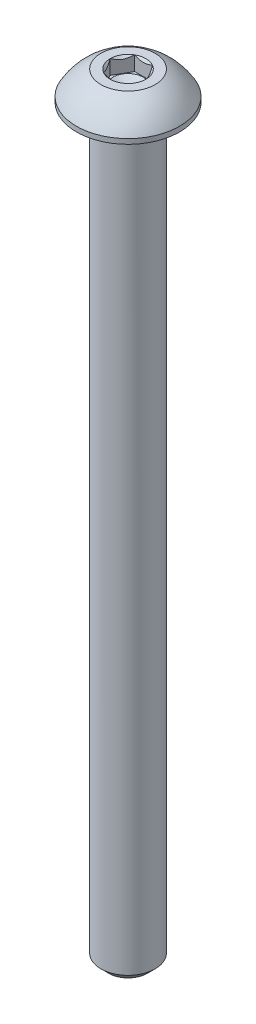
ISO-10303-21;
HEADER;
FILE_DESCRIPTION(('STEP AP214'),'2;1');
FILE_NAME('part.step','',(''),(''),'','','');
FILE_SCHEMA(('AUTOMOTIVE_DESIGN { 1 0 10303 214 1 1 1 1 }'));
ENDSEC;
DATA;
#1=APPLICATION_CONTEXT('core data for automotive mechanical design processes');
#2=APPLICATION_PROTOCOL_DEFINITION('international standard','automotive_design',2000,#1);
#3=PRODUCT_CONTEXT('',#1,'mechanical');
#4=PRODUCT('Part','Part','',(#3));
#5=PRODUCT_RELATED_PRODUCT_CATEGORY('part','',(#4));
#6=PRODUCT_DEFINITION_FORMATION('','',#4);
#7=PRODUCT_DEFINITION_CONTEXT('part definition',#1,'design');
#8=PRODUCT_DEFINITION('design','',#6,#7);
#9=PRODUCT_DEFINITION_SHAPE('','',#8);
#10=(LENGTH_UNIT() NAMED_UNIT(*) SI_UNIT(.MILLI.,.METRE.));
#11=(NAMED_UNIT(*) PLANE_ANGLE_UNIT() SI_UNIT($,.RADIAN.));
#12=(NAMED_UNIT(*) SI_UNIT($,.STERADIAN.) SOLID_ANGLE_UNIT());
#13=UNCERTAINTY_MEASURE_WITH_UNIT(LENGTH_MEASURE(1.E-05),#10,'distance_accuracy_value','');
#14=(GEOMETRIC_REPRESENTATION_CONTEXT(3) GLOBAL_UNCERTAINTY_ASSIGNED_CONTEXT((#13)) GLOBAL_UNIT_ASSIGNED_CONTEXT((#10,
#11,#12)) REPRESENTATION_CONTEXT('',''));
#15=CARTESIAN_POINT('',(0.,0.,0.));
#16=DIRECTION('',(0.,0.,1.));
#17=DIRECTION('',(1.,0.,0.));
#18=AXIS2_PLACEMENT_3D('',#15,#16,#17);
#19=CARTESIAN_POINT('',(0.,0.,0.));
#20=DIRECTION('',(0.,1.,0.));
#21=DIRECTION('',(0.,0.,1.));
#22=AXIS2_PLACEMENT_3D('',#19,#20,#21);
#23=PLANE('',#22);
#24=CARTESIAN_POINT('',(0.,0.,0.));
#25=DIRECTION('',(0.,-1.,0.));
#26=DIRECTION('',(-1.,0.,0.));
#27=AXIS2_PLACEMENT_3D('',#24,#25,#26);
#28=CIRCLE('',#27,1.4859);
#29=CARTESIAN_POINT('',(-1.4859,0.,0.));
#30=VERTEX_POINT('',#29);
#31=EDGE_CURVE('E182',#30,#30,#28,.T.);
#32=ORIENTED_EDGE('',*,*,#31,.T.);
#33=EDGE_LOOP('',(#32));
#34=FACE_BOUND('',#33,.T.);
#35=ADVANCED_FACE('F16',(#34),#23,.F.);
#36=CARTESIAN_POINT('',(0.,0.,0.));
#37=DIRECTION('',(0.,-1.,0.));
#38=DIRECTION('',(-1.,0.,0.));
#39=AXIS2_PLACEMENT_3D('',#36,#37,#38);
#40=CYLINDRICAL_SURFACE('',#39,2.0828);
#41=CARTESIAN_POINT('',(0.,57.15,0.));
#42=DIRECTION('',(0.,1.,0.));
#43=DIRECTION('',(-1.,0.,0.));
#44=AXIS2_PLACEMENT_3D('',#41,#42,#43);
#45=CIRCLE('',#44,2.0828);
#46=CARTESIAN_POINT('',(-2.0828,57.15,0.));
#47=VERTEX_POINT('',#46);
#48=EDGE_CURVE('E176',#47,#47,#45,.T.);
#49=ORIENTED_EDGE('',*,*,#48,.F.);
#50=EDGE_LOOP('',(#49));
#51=FACE_BOUND('',#50,.T.);
#52=CARTESIAN_POINT('',(0.,0.5969,0.));
#53=DIRECTION('',(0.,1.,0.));
#54=DIRECTION('',(-1.,0.,0.));
#55=AXIS2_PLACEMENT_3D('',#52,#53,#54);
#56=CIRCLE('',#55,2.0828);
#57=CARTESIAN_POINT('',(2.0828,0.5969,0.));
#58=VERTEX_POINT('',#57);
#59=EDGE_CURVE('E181',#58,#58,#56,.T.);
#60=ORIENTED_EDGE('',*,*,#59,.T.);
#61=EDGE_LOOP('',(#60));
#62=FACE_BOUND('',#61,.T.);
#63=ADVANCED_FACE('F507',(#51,#62),#40,.T.);
#64=CARTESIAN_POINT('',(0.,57.3405,0.));
#65=DIRECTION('',(0.,1.,0.));
#66=DIRECTION('',(0.,0.,-1.));
#67=AXIS2_PLACEMENT_3D('',#64,#65,#66);
#68=CYLINDRICAL_SURFACE('',#67,3.9624);
#69=CARTESIAN_POINT('',(0.,57.15,0.));
#70=DIRECTION('',(0.,-1.,0.));
#71=DIRECTION('',(1.,0.,0.));
#72=AXIS2_PLACEMENT_3D('',#69,#70,#71);
#73=CIRCLE('',#72,3.9624);
#74=CARTESIAN_POINT('',(0.,57.15,-3.9624));
#75=VERTEX_POINT('',#74);
#76=EDGE_CURVE('E96',#75,#75,#73,.T.);
#77=ORIENTED_EDGE('',*,*,#76,.F.);
#78=EDGE_LOOP('',(#77));
#79=FACE_BOUND('',#78,.T.);
#80=CARTESIAN_POINT('',(0.,57.531,0.));
#81=DIRECTION('',(0.,-1.,0.));
#82=DIRECTION('',(1.,0.,0.));
#83=AXIS2_PLACEMENT_3D('',#80,#81,#82);
#84=CIRCLE('',#83,3.9624);
#85=CARTESIAN_POINT('',(0.,57.531,-3.9624));
#86=VERTEX_POINT('',#85);
#87=EDGE_CURVE('E10',#86,#86,#84,.T.);
#88=ORIENTED_EDGE('',*,*,#87,.T.);
#89=EDGE_LOOP('',(#88));
#90=FACE_BOUND('',#89,.T.);
#91=ADVANCED_FACE('F317',(#79,#90),#68,.T.);
#92=CARTESIAN_POINT('',(0.,55.3388388888889,0.));
#93=DIRECTION('',(0.,0.,1.));
#94=DIRECTION('',(1.,0.,0.));
#95=AXIS2_PLACEMENT_3D('',#92,#93,#94);
#96=SPHERICAL_SURFACE('',#95,4.52837543685016);
#97=CARTESIAN_POINT('',(0.,55.3388388888889,0.));
#98=DIRECTION('',(0.,-1.,0.));
#99=DIRECTION('',(1.,0.,0.));
#100=AXIS2_PLACEMENT_3D('',#97,#98,#99);
#101=SPHERICAL_SURFACE('',#100,4.52837543685016);
#102=ORIENTED_EDGE('',*,*,#87,.F.);
#103=EDGE_LOOP('',(#102));
#104=FACE_BOUND('',#103,.T.);
#105=CARTESIAN_POINT('',(0.,59.3598,0.));
#106=DIRECTION('',(0.,-1.,0.));
#107=DIRECTION('',(1.,0.,0.));
#108=AXIS2_PLACEMENT_3D('',#105,#106,#107);
#109=CIRCLE('',#108,2.0828);
#110=CARTESIAN_POINT('',(0.,59.3598,-2.0828));
#111=VERTEX_POINT('',#110);
#112=EDGE_CURVE('E179',#111,#111,#109,.T.);
#113=ORIENTED_EDGE('',*,*,#112,.T.);
#114=EDGE_LOOP('',(#113));
#115=FACE_BOUND('',#114,.T.);
#116=ADVANCED_FACE('F315',(#104,#115),#101,.T.);
#117=CARTESIAN_POINT('',(0.,58.0771,0.));
#118=DIRECTION('',(0.,1.,0.));
#119=DIRECTION('',(0.,0.,-1.));
#120=AXIS2_PLACEMENT_3D('',#117,#118,#119);
#121=CONICAL_SURFACE('',#120,0.8763,1.03037682652431);
#122=CARTESIAN_POINT('',(0.,57.8866,0.));
#123=DIRECTION('',(0.,-1.,0.));
#124=DIRECTION('',(1.,0.,0.));
#125=AXIS2_PLACEMENT_3D('',#122,#123,#124);
#126=CIRCLE('',#125,0.5588);
#127=CARTESIAN_POINT('',(0.,57.8866,-0.5588));
#128=VERTEX_POINT('',#127);
#129=EDGE_CURVE('E27',#128,#128,#126,.T.);
#130=ORIENTED_EDGE('',*,*,#129,.T.);
#131=EDGE_LOOP('',(#130));
#132=FACE_BOUND('',#131,.T.);
#133=CARTESIAN_POINT('',(0.,58.2422,0.));
#134=DIRECTION('',(0.,1.,0.));
#135=DIRECTION('',(0.,0.,-1.));
#136=AXIS2_PLACEMENT_3D('',#133,#134,#135);
#137=CIRCLE('',#136,1.15146666666666);
#138=CARTESIAN_POINT('',(0.,58.2422,1.15146666666666));
#139=VERTEX_POINT('',#138);
#140=EDGE_CURVE('E103',#139,#139,#137,.T.);
#141=ORIENTED_EDGE('',*,*,#140,.T.);
#142=EDGE_LOOP('',(#141));
#143=FACE_BOUND('',#142,.T.);
#144=ADVANCED_FACE('F318',(#132,#143),#121,.F.);
#145=CARTESIAN_POINT('',(0.,57.8866,-0.5588));
#146=DIRECTION('',(0.,1.,0.));
#147=DIRECTION('',(0.,0.,1.));
#148=AXIS2_PLACEMENT_3D('',#145,#146,#147);
#149=PLANE('',#148);
#150=ORIENTED_EDGE('',*,*,#129,.F.);
#151=EDGE_LOOP('',(#150));
#152=FACE_BOUND('',#151,.T.);
#153=ADVANCED_FACE('F373',(#152),#149,.T.);
#154=CARTESIAN_POINT('',(0.,57.15,0.));
#155=DIRECTION('',(0.,-1.,0.));
#156=DIRECTION('',(0.,0.,-1.));
#157=AXIS2_PLACEMENT_3D('',#154,#155,#156);
#158=PLANE('',#157);
#159=ORIENTED_EDGE('',*,*,#48,.T.);
#160=EDGE_LOOP('',(#159));
#161=FACE_BOUND('',#160,.T.);
#162=ORIENTED_EDGE('',*,*,#76,.T.);
#163=EDGE_LOOP('',(#162));
#164=FACE_BOUND('',#163,.T.);
#165=ADVANCED_FACE('F366',(#161,#164),#158,.T.);
#166=CARTESIAN_POINT('',(0.,58.2422,0.));
#167=DIRECTION('',(0.,-1.,0.));
#168=DIRECTION('',(0.,0.,-1.));
#169=AXIS2_PLACEMENT_3D('',#166,#167,#168);
#170=PLANE('',#169);
#171=DIRECTION('',(0.5,0.,-0.866025403784439));
#172=VECTOR('',#171,1.);
#173=CARTESIAN_POINT('',(-0.689240751358575,58.2422,-1.1938));
#174=LINE('',#173,#172);
#175=CARTESIAN_POINT('',(-1.37848150271715,58.2422,0.));
#176=VERTEX_POINT('',#175);
#177=CARTESIAN_POINT('',(-0.689240751358575,58.2422,-1.1938));
#178=VERTEX_POINT('',#177);
#179=EDGE_CURVE('E124',#176,#178,#174,.T.);
#180=ORIENTED_EDGE('',*,*,#179,.F.);
#181=DIRECTION('',(-0.5,0.,-0.866025403784439));
#182=VECTOR('',#181,1.);
#183=CARTESIAN_POINT('',(-1.37848150271715,58.2422,0.));
#184=LINE('',#183,#182);
#185=CARTESIAN_POINT('',(-0.689240751358576,58.2422,1.1938));
#186=VERTEX_POINT('',#185);
#187=EDGE_CURVE('E212',#186,#176,#184,.T.);
#188=ORIENTED_EDGE('',*,*,#187,.F.);
#189=DIRECTION('',(-1.,0.,0.));
#190=VECTOR('',#189,1.);
#191=CARTESIAN_POINT('',(-0.689240751358576,58.2422,1.1938));
#192=LINE('',#191,#190);
#193=CARTESIAN_POINT('',(0.689240751358575,58.2422,1.1938));
#194=VERTEX_POINT('',#193);
#195=EDGE_CURVE('E146',#194,#186,#192,.T.);
#196=ORIENTED_EDGE('',*,*,#195,.F.);
#197=DIRECTION('',(-0.5,0.,0.866025403784438));
#198=VECTOR('',#197,1.);
#199=CARTESIAN_POINT('',(0.689240751358574,58.2422,1.1938));
#200=LINE('',#199,#198);
#201=CARTESIAN_POINT('',(1.37848150271715,58.2422,0.));
#202=VERTEX_POINT('',#201);
#203=EDGE_CURVE('E131',#202,#194,#200,.T.);
#204=ORIENTED_EDGE('',*,*,#203,.F.);
#205=DIRECTION('',(0.5,0.,0.866025403784439));
#206=VECTOR('',#205,1.);
#207=CARTESIAN_POINT('',(1.37848150271715,58.2422,0.));
#208=LINE('',#207,#206);
#209=CARTESIAN_POINT('',(0.689240751358575,58.2422,-1.1938));
#210=VERTEX_POINT('',#209);
#211=EDGE_CURVE('E148',#210,#202,#208,.T.);
#212=ORIENTED_EDGE('',*,*,#211,.F.);
#213=DIRECTION('',(1.,0.,0.));
#214=VECTOR('',#213,1.);
#215=CARTESIAN_POINT('',(0.689240751358575,58.2422,-1.1938));
#216=LINE('',#215,#214);
#217=EDGE_CURVE('E260',#178,#210,#216,.T.);
#218=ORIENTED_EDGE('',*,*,#217,.F.);
#219=EDGE_LOOP('',(#180,#188,#196,#204,#212,#218));
#220=FACE_BOUND('',#219,.T.);
#221=ORIENTED_EDGE('',*,*,#140,.F.);
#222=EDGE_LOOP('',(#221));
#223=FACE_BOUND('',#222,.T.);
#224=ADVANCED_FACE('F299',(#220,#223),#170,.F.);
#225=CARTESIAN_POINT('',(-1.37848150271715,59.3598,0.));
#226=DIRECTION('',(-0.866025403784439,0.,-0.5));
#227=DIRECTION('',(0.5,0.,-0.866025403784439));
#228=AXIS2_PLACEMENT_3D('',#225,#226,#227);
#229=PLANE('',#228);
#230=CARTESIAN_POINT('',(-0.696174837710028,59.3598,-1.18178981013521));
#231=CARTESIAN_POINT('',(-1.03386112703786,59.0272481481481,-0.596899999999999));
#232=CARTESIAN_POINT('',(-1.37154741636569,59.3598,-0.0120101898647889));
#233=(BOUNDED_CURVE() B_SPLINE_CURVE(2,(#230,#231,#232),.UNSPECIFIED.,.F.,
.F.) B_SPLINE_CURVE_WITH_KNOTS((3,3),(0.,0.139676907182255),
.UNSPECIFIED.) CURVE() GEOMETRIC_REPRESENTATION_ITEM() RATIONAL_B_SPLINE_CURVE((1.,
1.14893617021273,1.)) REPRESENTATION_ITEM(''));
#234=CARTESIAN_POINT('',(-0.696174837710028,59.3598,-1.18178981013521));
#235=VERTEX_POINT('',#234);
#236=CARTESIAN_POINT('',(-1.37154741636569,59.3598,-0.0120101898647889));
#237=VERTEX_POINT('',#236);
#238=EDGE_CURVE('E194',#235,#237,#233,.T.);
#239=ORIENTED_EDGE('',*,*,#238,.T.);
#240=DIRECTION('',(0.5,0.,-0.866025403784439));
#241=VECTOR('',#240,1.);
#242=CARTESIAN_POINT('',(-0.755231887126948,59.3598,-1.0795));
#243=LINE('',#242,#241);
#244=CARTESIAN_POINT('',(-1.37848150271715,59.3598,0.));
#245=VERTEX_POINT('',#244);
#246=EDGE_CURVE('E193',#245,#237,#243,.T.);
#247=ORIENTED_EDGE('',*,*,#246,.F.);
#248=DIRECTION('',(0.,-1.,0.));
#249=VECTOR('',#248,1.);
#250=CARTESIAN_POINT('',(-1.37848150271715,59.3598,0.));
#251=LINE('',#250,#249);
#252=EDGE_CURVE('E211',#245,#176,#251,.T.);
#253=ORIENTED_EDGE('',*,*,#252,.T.);
#254=ORIENTED_EDGE('',*,*,#179,.T.);
#255=DIRECTION('',(0.,-1.,0.));
#256=VECTOR('',#255,1.);
#257=CARTESIAN_POINT('',(-0.689240751358575,59.3598,-1.1938));
#258=LINE('',#257,#256);
#259=CARTESIAN_POINT('',(-0.689240751358575,59.3598,-1.1938));
#260=VERTEX_POINT('',#259);
#261=EDGE_CURVE('E234',#260,#178,#258,.T.);
#262=ORIENTED_EDGE('',*,*,#261,.F.);
#263=DIRECTION('',(0.5,0.,-0.866025403784439));
#264=VECTOR('',#263,1.);
#265=CARTESIAN_POINT('',(-0.755231887126948,59.3598,-1.0795));
#266=LINE('',#265,#264);
#267=EDGE_CURVE('E175',#235,#260,#266,.T.);
#268=ORIENTED_EDGE('',*,*,#267,.F.);
#269=EDGE_LOOP('',(#239,#247,#253,#254,#262,#268));
#270=FACE_BOUND('',#269,.T.);
#271=ADVANCED_FACE('F359',(#270),#229,.F.);
#272=CARTESIAN_POINT('',(-0.689240751358575,59.3598,-1.1938));
#273=DIRECTION('',(0.,0.,-1.));
#274=DIRECTION('',(1.,0.,0.));
#275=AXIS2_PLACEMENT_3D('',#272,#273,#274);
#276=PLANE('',#275);
#277=CARTESIAN_POINT('',(0.67537257865567,59.3598,-1.1938));
#278=CARTESIAN_POINT('',(0.,59.0272481481481,-1.1938));
#279=CARTESIAN_POINT('',(-0.675372578655669,59.3598,-1.1938));
#280=(BOUNDED_CURVE() B_SPLINE_CURVE(2,(#277,#278,#279),.UNSPECIFIED.,.F.,
.F.) B_SPLINE_CURVE_WITH_KNOTS((3,3),(0.,0.139676907182255),
.UNSPECIFIED.) CURVE() GEOMETRIC_REPRESENTATION_ITEM() RATIONAL_B_SPLINE_CURVE((1.,
1.14893617021273,1.)) REPRESENTATION_ITEM(''));
#281=CARTESIAN_POINT('',(0.675372578655669,59.3598,-1.1938));
#282=VERTEX_POINT('',#281);
#283=CARTESIAN_POINT('',(-0.675372578655669,59.3598,-1.1938));
#284=VERTEX_POINT('',#283);
#285=EDGE_CURVE('E209',#282,#284,#280,.T.);
#286=ORIENTED_EDGE('',*,*,#285,.T.);
#287=DIRECTION('',(1.,0.,0.));
#288=VECTOR('',#287,1.);
#289=CARTESIAN_POINT('',(-0.344620375679287,59.3598,-1.1938));
#290=LINE('',#289,#288);
#291=EDGE_CURVE('E174',#260,#284,#290,.T.);
#292=ORIENTED_EDGE('',*,*,#291,.F.);
#293=ORIENTED_EDGE('',*,*,#261,.T.);
#294=ORIENTED_EDGE('',*,*,#217,.T.);
#295=DIRECTION('',(0.,-1.,0.));
#296=VECTOR('',#295,1.);
#297=CARTESIAN_POINT('',(0.689240751358575,59.3598,-1.1938));
#298=LINE('',#297,#296);
#299=CARTESIAN_POINT('',(0.689240751358575,59.3598,-1.1938));
#300=VERTEX_POINT('',#299);
#301=EDGE_CURVE('E230',#300,#210,#298,.T.);
#302=ORIENTED_EDGE('',*,*,#301,.F.);
#303=DIRECTION('',(1.,0.,0.));
#304=VECTOR('',#303,1.);
#305=CARTESIAN_POINT('',(-0.344620375679287,59.3598,-1.1938));
#306=LINE('',#305,#304);
#307=EDGE_CURVE('E169',#282,#300,#306,.T.);
#308=ORIENTED_EDGE('',*,*,#307,.F.);
#309=EDGE_LOOP('',(#286,#292,#293,#294,#302,#308));
#310=FACE_BOUND('',#309,.T.);
#311=ADVANCED_FACE('F347',(#310),#276,.F.);
#312=CARTESIAN_POINT('',(0.689240751358575,59.3598,-1.1938));
#313=DIRECTION('',(0.866025403784439,0.,-0.5));
#314=DIRECTION('',(0.5,0.,0.866025403784439));
#315=AXIS2_PLACEMENT_3D('',#312,#313,#314);
#316=PLANE('',#315);
#317=CARTESIAN_POINT('',(1.37154741636569,59.3598,-0.0120101898647868));
#318=CARTESIAN_POINT('',(1.03386112703786,59.0272481481481,-0.596899999999998));
#319=CARTESIAN_POINT('',(0.696174837710028,59.3598,-1.18178981013521));
#320=(BOUNDED_CURVE() B_SPLINE_CURVE(2,(#317,#318,#319),.UNSPECIFIED.,.F.,
.F.) B_SPLINE_CURVE_WITH_KNOTS((3,3),(0.,0.139676907182255),
.UNSPECIFIED.) CURVE() GEOMETRIC_REPRESENTATION_ITEM() RATIONAL_B_SPLINE_CURVE((1.,
1.14893617021273,1.)) REPRESENTATION_ITEM(''));
#321=CARTESIAN_POINT('',(1.37154741636569,59.3598,-0.0120101898647873));
#322=VERTEX_POINT('',#321);
#323=CARTESIAN_POINT('',(0.696174837710029,59.3598,-1.18178981013521));
#324=VERTEX_POINT('',#323);
#325=EDGE_CURVE('E207',#322,#324,#320,.T.);
#326=ORIENTED_EDGE('',*,*,#325,.T.);
#327=DIRECTION('',(0.5,0.,0.866025403784439));
#328=VECTOR('',#327,1.);
#329=CARTESIAN_POINT('',(0.410611511447661,59.3598,-1.6764));
#330=LINE('',#329,#328);
#331=EDGE_CURVE('E167',#300,#324,#330,.T.);
#332=ORIENTED_EDGE('',*,*,#331,.F.);
#333=ORIENTED_EDGE('',*,*,#301,.T.);
#334=ORIENTED_EDGE('',*,*,#211,.T.);
#335=DIRECTION('',(0.,-1.,0.));
#336=VECTOR('',#335,1.);
#337=CARTESIAN_POINT('',(1.37848150271715,59.3598,0.));
#338=LINE('',#337,#336);
#339=CARTESIAN_POINT('',(1.37848150271715,59.3598,0.));
#340=VERTEX_POINT('',#339);
#341=EDGE_CURVE('E140',#340,#202,#338,.T.);
#342=ORIENTED_EDGE('',*,*,#341,.F.);
#343=DIRECTION('',(0.5,0.,0.866025403784439));
#344=VECTOR('',#343,1.);
#345=CARTESIAN_POINT('',(0.410611511447661,59.3598,-1.6764));
#346=LINE('',#345,#344);
#347=EDGE_CURVE('E142',#322,#340,#346,.T.);
#348=ORIENTED_EDGE('',*,*,#347,.F.);
#349=EDGE_LOOP('',(#326,#332,#333,#334,#342,#348));
#350=FACE_BOUND('',#349,.T.);
#351=ADVANCED_FACE('F139',(#350),#316,.F.);
#352=CARTESIAN_POINT('',(1.37848150271715,59.3598,0.));
#353=DIRECTION('',(0.866025403784438,0.,0.5));
#354=DIRECTION('',(-0.5,0.,0.866025403784438));
#355=AXIS2_PLACEMENT_3D('',#352,#353,#354);
#356=PLANE('',#355);
#357=CARTESIAN_POINT('',(0.696174837710034,59.3598,1.18178981013521));
#358=CARTESIAN_POINT('',(1.03386112703786,59.0272481481481,0.596900000000002));
#359=CARTESIAN_POINT('',(1.37154741636569,59.3598,0.0120101898647961));
#360=(BOUNDED_CURVE() B_SPLINE_CURVE(2,(#357,#358,#359),.UNSPECIFIED.,.F.,
.F.) B_SPLINE_CURVE_WITH_KNOTS((3,3),(0.,0.139676907182253),
.UNSPECIFIED.) CURVE() GEOMETRIC_REPRESENTATION_ITEM() RATIONAL_B_SPLINE_CURVE((1.,
1.1489361702128,1.)) REPRESENTATION_ITEM(''));
#361=CARTESIAN_POINT('',(0.696174837710034,59.3598,1.18178981013521));
#362=VERTEX_POINT('',#361);
#363=CARTESIAN_POINT('',(1.37154741636569,59.3598,0.0120101898647965));
#364=VERTEX_POINT('',#363);
#365=EDGE_CURVE('E152',#362,#364,#360,.T.);
#366=ORIENTED_EDGE('',*,*,#365,.T.);
#367=DIRECTION('',(-0.5,0.,0.866025403784438));
#368=VECTOR('',#367,1.);
#369=CARTESIAN_POINT('',(1.65711074262806,59.3598,-0.4826));
#370=LINE('',#369,#368);
#371=EDGE_CURVE('E151',#340,#364,#370,.T.);
#372=ORIENTED_EDGE('',*,*,#371,.F.);
#373=ORIENTED_EDGE('',*,*,#341,.T.);
#374=ORIENTED_EDGE('',*,*,#203,.T.);
#375=DIRECTION('',(0.,-1.,0.));
#376=VECTOR('',#375,1.);
#377=CARTESIAN_POINT('',(0.689240751358574,59.3598,1.1938));
#378=LINE('',#377,#376);
#379=CARTESIAN_POINT('',(0.689240751358574,59.3598,1.1938));
#380=VERTEX_POINT('',#379);
#381=EDGE_CURVE('E19',#380,#194,#378,.T.);
#382=ORIENTED_EDGE('',*,*,#381,.F.);
#383=DIRECTION('',(-0.5,0.,0.866025403784438));
#384=VECTOR('',#383,1.);
#385=CARTESIAN_POINT('',(1.65711074262806,59.3598,-0.4826));
#386=LINE('',#385,#384);
#387=EDGE_CURVE('E158',#362,#380,#386,.T.);
#388=ORIENTED_EDGE('',*,*,#387,.F.);
#389=EDGE_LOOP('',(#366,#372,#373,#374,#382,#388));
#390=FACE_BOUND('',#389,.T.);
#391=ADVANCED_FACE('F155',(#390),#356,.F.);
#392=CARTESIAN_POINT('',(0.689240751358574,59.3598,1.1938));
#393=DIRECTION('',(0.,0.,1.));
#394=DIRECTION('',(-1.,0.,0.));
#395=AXIS2_PLACEMENT_3D('',#392,#393,#394);
#396=PLANE('',#395);
#397=CARTESIAN_POINT('',(-0.675372578655659,59.3598,1.1938));
#398=CARTESIAN_POINT('',(0.,59.0272481481482,1.1938));
#399=CARTESIAN_POINT('',(0.675372578655657,59.3598,1.1938));
#400=(BOUNDED_CURVE() B_SPLINE_CURVE(2,(#397,#398,#399),.UNSPECIFIED.,.F.,
.F.) B_SPLINE_CURVE_WITH_KNOTS((3,3),(0.,0.139676907182253),
.UNSPECIFIED.) CURVE() GEOMETRIC_REPRESENTATION_ITEM() RATIONAL_B_SPLINE_CURVE((1.,
1.14893617021267,1.)) REPRESENTATION_ITEM(''));
#401=CARTESIAN_POINT('',(-0.675372578655658,59.3598,1.1938));
#402=VERTEX_POINT('',#401);
#403=CARTESIAN_POINT('',(0.675372578655657,59.3598,1.1938));
#404=VERTEX_POINT('',#403);
#405=EDGE_CURVE('E187',#402,#404,#400,.T.);
#406=ORIENTED_EDGE('',*,*,#405,.T.);
#407=DIRECTION('',(-1.,0.,0.));
#408=VECTOR('',#407,1.);
#409=CARTESIAN_POINT('',(0.344620375679286,59.3598,1.1938));
#410=LINE('',#409,#408);
#411=EDGE_CURVE('E199',#380,#404,#410,.T.);
#412=ORIENTED_EDGE('',*,*,#411,.F.);
#413=ORIENTED_EDGE('',*,*,#381,.T.);
#414=ORIENTED_EDGE('',*,*,#195,.T.);
#415=DIRECTION('',(0.,-1.,0.));
#416=VECTOR('',#415,1.);
#417=CARTESIAN_POINT('',(-0.689240751358576,59.3598,1.1938));
#418=LINE('',#417,#416);
#419=CARTESIAN_POINT('',(-0.689240751358576,59.3598,1.1938));
#420=VERTEX_POINT('',#419);
#421=EDGE_CURVE('E171',#420,#186,#418,.T.);
#422=ORIENTED_EDGE('',*,*,#421,.F.);
#423=DIRECTION('',(-1.,0.,0.));
#424=VECTOR('',#423,1.);
#425=CARTESIAN_POINT('',(0.344620375679286,59.3598,1.1938));
#426=LINE('',#425,#424);
#427=EDGE_CURVE('E202',#402,#420,#426,.T.);
#428=ORIENTED_EDGE('',*,*,#427,.F.);
#429=EDGE_LOOP('',(#406,#412,#413,#414,#422,#428));
#430=FACE_BOUND('',#429,.T.);
#431=ADVANCED_FACE('F304',(#430),#396,.F.);
#432=CARTESIAN_POINT('',(-0.689240751358576,59.3598,1.1938));
#433=DIRECTION('',(-0.866025403784439,0.,0.5));
#434=DIRECTION('',(-0.5,0.,-0.866025403784439));
#435=AXIS2_PLACEMENT_3D('',#432,#433,#434);
#436=PLANE('',#435);
#437=CARTESIAN_POINT('',(-1.37154741636569,59.3598,0.0120101898647937));
#438=CARTESIAN_POINT('',(-1.03386112703786,59.0272481481481,0.5969));
#439=CARTESIAN_POINT('',(-0.696174837710034,59.3598,1.18178981013521));
#440=(BOUNDED_CURVE() B_SPLINE_CURVE(2,(#437,#438,#439),.UNSPECIFIED.,.F.,
.F.) B_SPLINE_CURVE_WITH_KNOTS((3,3),(0.,0.139676907182254),
.UNSPECIFIED.) CURVE() GEOMETRIC_REPRESENTATION_ITEM() RATIONAL_B_SPLINE_CURVE((1.,
1.1489361702128,1.)) REPRESENTATION_ITEM(''));
#441=CARTESIAN_POINT('',(-1.37154741636569,59.3598,0.0120101898647945));
#442=VERTEX_POINT('',#441);
#443=CARTESIAN_POINT('',(-0.696174837710035,59.3598,1.18178981013521));
#444=VERTEX_POINT('',#443);
#445=EDGE_CURVE('E185',#442,#444,#440,.T.);
#446=ORIENTED_EDGE('',*,*,#445,.T.);
#447=DIRECTION('',(-0.5,0.,-0.866025403784439));
#448=VECTOR('',#447,1.);
#449=CARTESIAN_POINT('',(-1.31249036694878,59.3598,0.114300000000001));
#450=LINE('',#449,#448);
#451=EDGE_CURVE('E248',#420,#444,#450,.T.);
#452=ORIENTED_EDGE('',*,*,#451,.F.);
#453=ORIENTED_EDGE('',*,*,#421,.T.);
#454=ORIENTED_EDGE('',*,*,#187,.T.);
#455=ORIENTED_EDGE('',*,*,#252,.F.);
#456=DIRECTION('',(-0.5,0.,-0.866025403784439));
#457=VECTOR('',#456,1.);
#458=CARTESIAN_POINT('',(-1.31249036694878,59.3598,0.114300000000001));
#459=LINE('',#458,#457);
#460=EDGE_CURVE('E227',#442,#245,#459,.T.);
#461=ORIENTED_EDGE('',*,*,#460,.F.);
#462=EDGE_LOOP('',(#446,#452,#453,#454,#455,#461));
#463=FACE_BOUND('',#462,.T.);
#464=ADVANCED_FACE('F300',(#463),#436,.F.);
#465=CARTESIAN_POINT('',(0.,59.3598,-2.0828));
#466=DIRECTION('',(0.,1.,0.));
#467=DIRECTION('',(0.,0.,1.));
#468=AXIS2_PLACEMENT_3D('',#465,#466,#467);
#469=PLANE('',#468);
#470=CARTESIAN_POINT('',(0.,59.3598,0.));
#471=DIRECTION('',(0.,-1.,0.));
#472=DIRECTION('',(-1.,0.,0.));
#473=AXIS2_PLACEMENT_3D('',#470,#471,#472);
#474=CIRCLE('',#473,1.3716);
#475=EDGE_CURVE('E178',#444,#442,#474,.T.);
#476=ORIENTED_EDGE('',*,*,#475,.T.);
#477=ORIENTED_EDGE('',*,*,#460,.T.);
#478=ORIENTED_EDGE('',*,*,#246,.T.);
#479=CARTESIAN_POINT('',(0.,59.3598,0.));
#480=DIRECTION('',(0.,-1.,0.));
#481=DIRECTION('',(-1.,0.,0.));
#482=AXIS2_PLACEMENT_3D('',#479,#480,#481);
#483=CIRCLE('',#482,1.3716);
#484=EDGE_CURVE('E218',#237,#235,#483,.T.);
#485=ORIENTED_EDGE('',*,*,#484,.T.);
#486=ORIENTED_EDGE('',*,*,#267,.T.);
#487=ORIENTED_EDGE('',*,*,#291,.T.);
#488=CARTESIAN_POINT('',(0.,59.3598,0.));
#489=DIRECTION('',(0.,-1.,0.));
#490=DIRECTION('',(-1.,0.,0.));
#491=AXIS2_PLACEMENT_3D('',#488,#489,#490);
#492=CIRCLE('',#491,1.3716);
#493=EDGE_CURVE('E206',#284,#282,#492,.T.);
#494=ORIENTED_EDGE('',*,*,#493,.T.);
#495=ORIENTED_EDGE('',*,*,#307,.T.);
#496=ORIENTED_EDGE('',*,*,#331,.T.);
#497=CARTESIAN_POINT('',(0.,59.3598,0.));
#498=DIRECTION('',(0.,-1.,0.));
#499=DIRECTION('',(-1.,0.,0.));
#500=AXIS2_PLACEMENT_3D('',#497,#498,#499);
#501=CIRCLE('',#500,1.3716);
#502=EDGE_CURVE('E163',#324,#322,#501,.T.);
#503=ORIENTED_EDGE('',*,*,#502,.T.);
#504=ORIENTED_EDGE('',*,*,#347,.T.);
#505=ORIENTED_EDGE('',*,*,#371,.T.);
#506=CARTESIAN_POINT('',(0.,59.3598,0.));
#507=DIRECTION('',(0.,-1.,0.));
#508=DIRECTION('',(-1.,0.,0.));
#509=AXIS2_PLACEMENT_3D('',#506,#507,#508);
#510=CIRCLE('',#509,1.3716);
#511=EDGE_CURVE('E240',#364,#362,#510,.T.);
#512=ORIENTED_EDGE('',*,*,#511,.T.);
#513=ORIENTED_EDGE('',*,*,#387,.T.);
#514=ORIENTED_EDGE('',*,*,#411,.T.);
#515=CARTESIAN_POINT('',(0.,59.3598,0.));
#516=DIRECTION('',(0.,-1.,0.));
#517=DIRECTION('',(-1.,0.,0.));
#518=AXIS2_PLACEMENT_3D('',#515,#516,#517);
#519=CIRCLE('',#518,1.3716);
#520=EDGE_CURVE('E184',#404,#402,#519,.T.);
#521=ORIENTED_EDGE('',*,*,#520,.T.);
#522=ORIENTED_EDGE('',*,*,#427,.T.);
#523=ORIENTED_EDGE('',*,*,#451,.T.);
#524=EDGE_LOOP('',(#476,#477,#478,#485,#486,#487,#494,#495,#496,#503,#504,#505,#512,#513,#514,
#521,#522,#523));
#525=FACE_BOUND('',#524,.T.);
#526=ORIENTED_EDGE('',*,*,#112,.F.);
#527=EDGE_LOOP('',(#526));
#528=FACE_BOUND('',#527,.T.);
#529=ADVANCED_FACE('F161',(#525,#528),#469,.T.);
#530=CARTESIAN_POINT('',(0.,58.801,0.));
#531=DIRECTION('',(0.,1.,0.));
#532=DIRECTION('',(-1.,0.,0.));
#533=AXIS2_PLACEMENT_3D('',#530,#531,#532);
#534=CONICAL_SURFACE('',#533,0.8128,0.785398163397449);
#535=ORIENTED_EDGE('',*,*,#445,.F.);
#536=ORIENTED_EDGE('',*,*,#475,.F.);
#537=EDGE_LOOP('',(#535,#536));
#538=FACE_BOUND('',#537,.T.);
#539=ADVANCED_FACE('F396',(#538),#534,.F.);
#540=CARTESIAN_POINT('',(0.,58.801,0.));
#541=DIRECTION('',(0.,1.,0.));
#542=DIRECTION('',(-1.,0.,0.));
#543=AXIS2_PLACEMENT_3D('',#540,#541,#542);
#544=CONICAL_SURFACE('',#543,0.8128,0.785398163397449);
#545=ORIENTED_EDGE('',*,*,#405,.F.);
#546=ORIENTED_EDGE('',*,*,#520,.F.);
#547=EDGE_LOOP('',(#545,#546));
#548=FACE_BOUND('',#547,.T.);
#549=ADVANCED_FACE('F391',(#548),#544,.F.);
#550=CARTESIAN_POINT('',(0.,58.801,0.));
#551=DIRECTION('',(0.,1.,0.));
#552=DIRECTION('',(-1.,0.,0.));
#553=AXIS2_PLACEMENT_3D('',#550,#551,#552);
#554=CONICAL_SURFACE('',#553,0.8128,0.785398163397449);
#555=ORIENTED_EDGE('',*,*,#365,.F.);
#556=ORIENTED_EDGE('',*,*,#511,.F.);
#557=EDGE_LOOP('',(#555,#556));
#558=FACE_BOUND('',#557,.T.);
#559=ADVANCED_FACE('F336',(#558),#554,.F.);
#560=CARTESIAN_POINT('',(0.,58.801,0.));
#561=DIRECTION('',(0.,1.,0.));
#562=DIRECTION('',(-1.,0.,0.));
#563=AXIS2_PLACEMENT_3D('',#560,#561,#562);
#564=CONICAL_SURFACE('',#563,0.8128,0.785398163397449);
#565=ORIENTED_EDGE('',*,*,#325,.F.);
#566=ORIENTED_EDGE('',*,*,#502,.F.);
#567=EDGE_LOOP('',(#565,#566));
#568=FACE_BOUND('',#567,.T.);
#569=ADVANCED_FACE('F329',(#568),#564,.F.);
#570=CARTESIAN_POINT('',(0.,58.801,0.));
#571=DIRECTION('',(0.,1.,0.));
#572=DIRECTION('',(-1.,0.,0.));
#573=AXIS2_PLACEMENT_3D('',#570,#571,#572);
#574=CONICAL_SURFACE('',#573,0.8128,0.785398163397449);
#575=ORIENTED_EDGE('',*,*,#285,.F.);
#576=ORIENTED_EDGE('',*,*,#493,.F.);
#577=EDGE_LOOP('',(#575,#576));
#578=FACE_BOUND('',#577,.T.);
#579=ADVANCED_FACE('F333',(#578),#574,.F.);
#580=CARTESIAN_POINT('',(0.,58.801,0.));
#581=DIRECTION('',(0.,1.,0.));
#582=DIRECTION('',(-1.,0.,0.));
#583=AXIS2_PLACEMENT_3D('',#580,#581,#582);
#584=CONICAL_SURFACE('',#583,0.8128,0.785398163397449);
#585=ORIENTED_EDGE('',*,*,#238,.F.);
#586=ORIENTED_EDGE('',*,*,#484,.F.);
#587=EDGE_LOOP('',(#585,#586));
#588=FACE_BOUND('',#587,.T.);
#589=ADVANCED_FACE('F410',(#588),#584,.F.);
#590=CARTESIAN_POINT('',(0.,0.504431527502194,0.));
#591=DIRECTION('',(0.,1.,0.));
#592=DIRECTION('',(-1.,0.,0.));
#593=AXIS2_PLACEMENT_3D('',#590,#591,#592);
#594=CONICAL_SURFACE('',#593,1.9903315275022,0.785398163397449);
#595=ORIENTED_EDGE('',*,*,#31,.F.);
#596=EDGE_LOOP('',(#595));
#597=FACE_BOUND('',#596,.T.);
#598=ORIENTED_EDGE('',*,*,#59,.F.);
#599=EDGE_LOOP('',(#598));
#600=FACE_BOUND('',#599,.T.);
#601=ADVANCED_FACE('F422',(#597,#600),#594,.T.);
#602=CLOSED_SHELL('',(#35,#63,#91,#116,#144,#153,#165,#224,#271,#311,#351,#391,#431,#464,#529,
#539,#549,#559,#569,#579,#589,#601));
#603=MANIFOLD_SOLID_BREP('B1',#602);
#604=ADVANCED_BREP_SHAPE_REPRESENTATION('',(#18,#603),#14);
#605=SHAPE_DEFINITION_REPRESENTATION(#9,#604);
ENDSEC;
END-ISO-10303-21;
